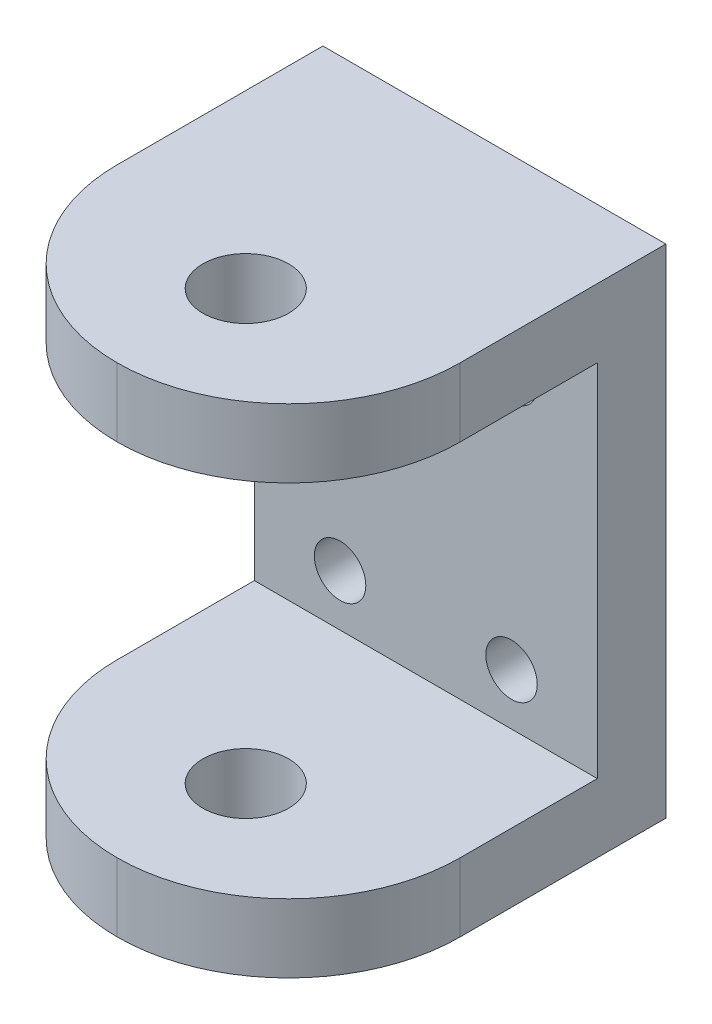
ISO-10303-21;
HEADER;
FILE_DESCRIPTION(('STEP AP214'),'2;1');
FILE_NAME('part.step','',(''),(''),'','','');
FILE_SCHEMA(('AUTOMOTIVE_DESIGN { 1 0 10303 214 1 1 1 1 }'));
ENDSEC;
DATA;
#1=APPLICATION_CONTEXT('core data for automotive mechanical design processes');
#2=APPLICATION_PROTOCOL_DEFINITION('international standard','automotive_design',2000,#1);
#3=PRODUCT_CONTEXT('',#1,'mechanical');
#4=PRODUCT('Part','Part','',(#3));
#5=PRODUCT_RELATED_PRODUCT_CATEGORY('part','',(#4));
#6=PRODUCT_DEFINITION_FORMATION('','',#4);
#7=PRODUCT_DEFINITION_CONTEXT('part definition',#1,'design');
#8=PRODUCT_DEFINITION('design','',#6,#7);
#9=PRODUCT_DEFINITION_SHAPE('','',#8);
#10=(LENGTH_UNIT() NAMED_UNIT(*) SI_UNIT(.MILLI.,.METRE.));
#11=(NAMED_UNIT(*) PLANE_ANGLE_UNIT() SI_UNIT($,.RADIAN.));
#12=(NAMED_UNIT(*) SI_UNIT($,.STERADIAN.) SOLID_ANGLE_UNIT());
#13=UNCERTAINTY_MEASURE_WITH_UNIT(LENGTH_MEASURE(1.E-05),#10,'distance_accuracy_value','');
#14=(GEOMETRIC_REPRESENTATION_CONTEXT(3) GLOBAL_UNCERTAINTY_ASSIGNED_CONTEXT((#13)) GLOBAL_UNIT_ASSIGNED_CONTEXT((#10,
#11,#12)) REPRESENTATION_CONTEXT('',''));
#15=CARTESIAN_POINT('',(0.,0.,0.));
#16=DIRECTION('',(0.,0.,1.));
#17=DIRECTION('',(1.,0.,0.));
#18=AXIS2_PLACEMENT_3D('',#15,#16,#17);
#19=CARTESIAN_POINT('',(0.,0.,4.));
#20=DIRECTION('',(0.,0.,1.));
#21=DIRECTION('',(1.,0.,0.));
#22=AXIS2_PLACEMENT_3D('',#19,#20,#21);
#23=PLANE('',#22);
#24=CARTESIAN_POINT('',(5.,-7.5,4.));
#25=DIRECTION('',(0.,0.,1.));
#26=DIRECTION('',(1.,0.,0.));
#27=AXIS2_PLACEMENT_3D('',#24,#25,#26);
#28=CIRCLE('',#27,1.5);
#29=CARTESIAN_POINT('',(6.5,-7.5,4.));
#30=VERTEX_POINT('',#29);
#31=EDGE_CURVE('E151',#30,#30,#28,.T.);
#32=ORIENTED_EDGE('',*,*,#31,.F.);
#33=EDGE_LOOP('',(#32));
#34=FACE_BOUND('',#33,.T.);
#35=CARTESIAN_POINT('',(-4.99999999999999,-7.5,4.));
#36=DIRECTION('',(0.,0.,1.));
#37=DIRECTION('',(1.,0.,0.));
#38=AXIS2_PLACEMENT_3D('',#35,#36,#37);
#39=CIRCLE('',#38,1.5);
#40=CARTESIAN_POINT('',(-3.49999999999999,-7.5,4.));
#41=VERTEX_POINT('',#40);
#42=EDGE_CURVE('E154',#41,#41,#39,.T.);
#43=ORIENTED_EDGE('',*,*,#42,.F.);
#44=EDGE_LOOP('',(#43));
#45=FACE_BOUND('',#44,.T.);
#46=CARTESIAN_POINT('',(5.,7.5,4.));
#47=DIRECTION('',(0.,0.,1.));
#48=DIRECTION('',(1.,0.,0.));
#49=AXIS2_PLACEMENT_3D('',#46,#47,#48);
#50=CIRCLE('',#49,1.5);
#51=CARTESIAN_POINT('',(6.5,7.5,4.));
#52=VERTEX_POINT('',#51);
#53=EDGE_CURVE('E158',#52,#52,#50,.T.);
#54=ORIENTED_EDGE('',*,*,#53,.F.);
#55=EDGE_LOOP('',(#54));
#56=FACE_BOUND('',#55,.T.);
#57=CARTESIAN_POINT('',(-5.,7.5,4.));
#58=DIRECTION('',(0.,0.,1.));
#59=DIRECTION('',(1.,0.,0.));
#60=AXIS2_PLACEMENT_3D('',#57,#58,#59);
#61=CIRCLE('',#60,1.5);
#62=CARTESIAN_POINT('',(-3.5,7.5,4.));
#63=VERTEX_POINT('',#62);
#64=EDGE_CURVE('E139',#63,#63,#61,.T.);
#65=ORIENTED_EDGE('',*,*,#64,.F.);
#66=EDGE_LOOP('',(#65));
#67=FACE_BOUND('',#66,.T.);
#68=DIRECTION('',(0.,-1.,0.));
#69=VECTOR('',#68,1.);
#70=CARTESIAN_POINT('',(-10.,0.,4.));
#71=LINE('',#70,#69);
#72=CARTESIAN_POINT('',(-10.,10.5,4.));
#73=VERTEX_POINT('',#72);
#74=CARTESIAN_POINT('',(-10.,-10.5,4.));
#75=VERTEX_POINT('',#74);
#76=EDGE_CURVE('E138',#73,#75,#71,.T.);
#77=ORIENTED_EDGE('',*,*,#76,.T.);
#78=DIRECTION('',(-1.,0.,0.));
#79=VECTOR('',#78,1.);
#80=CARTESIAN_POINT('',(10.,-10.5,4.));
#81=LINE('',#80,#79);
#82=CARTESIAN_POINT('',(10.,-10.5,4.));
#83=VERTEX_POINT('',#82);
#84=EDGE_CURVE('E137',#83,#75,#81,.T.);
#85=ORIENTED_EDGE('',*,*,#84,.F.);
#86=DIRECTION('',(0.,-1.,0.));
#87=VECTOR('',#86,1.);
#88=CARTESIAN_POINT('',(10.,0.,4.));
#89=LINE('',#88,#87);
#90=CARTESIAN_POINT('',(10.,10.5,4.));
#91=VERTEX_POINT('',#90);
#92=EDGE_CURVE('E123',#91,#83,#89,.T.);
#93=ORIENTED_EDGE('',*,*,#92,.F.);
#94=DIRECTION('',(1.,0.,0.));
#95=VECTOR('',#94,1.);
#96=CARTESIAN_POINT('',(-10.,10.5,4.));
#97=LINE('',#96,#95);
#98=EDGE_CURVE('E129',#73,#91,#97,.T.);
#99=ORIENTED_EDGE('',*,*,#98,.F.);
#100=EDGE_LOOP('',(#77,#85,#93,#99));
#101=FACE_BOUND('',#100,.T.);
#102=ADVANCED_FACE('F39',(#34,#45,#56,#67,#101),#23,.T.);
#103=CARTESIAN_POINT('',(10.,0.,4.));
#104=DIRECTION('',(1.,0.,0.));
#105=DIRECTION('',(0.,1.,0.));
#106=AXIS2_PLACEMENT_3D('',#103,#104,#105);
#107=PLANE('',#106);
#108=DIRECTION('',(0.,0.,-1.));
#109=VECTOR('',#108,1.);
#110=CARTESIAN_POINT('',(10.,14.5,4.));
#111=LINE('',#110,#109);
#112=CARTESIAN_POINT('',(10.,14.5,12.));
#113=VERTEX_POINT('',#112);
#114=CARTESIAN_POINT('',(10.,14.5,0.));
#115=VERTEX_POINT('',#114);
#116=EDGE_CURVE('E192',#113,#115,#111,.T.);
#117=ORIENTED_EDGE('',*,*,#116,.F.);
#118=DIRECTION('',(0.,1.,0.));
#119=VECTOR('',#118,1.);
#120=CARTESIAN_POINT('',(10.,0.,12.));
#121=LINE('',#120,#119);
#122=CARTESIAN_POINT('',(10.,10.5,12.));
#123=VERTEX_POINT('',#122);
#124=EDGE_CURVE('E125',#113,#123,#121,.F.);
#125=ORIENTED_EDGE('',*,*,#124,.T.);
#126=DIRECTION('',(0.,0.,-1.));
#127=VECTOR('',#126,1.);
#128=CARTESIAN_POINT('',(10.,10.5,22.));
#129=LINE('',#128,#127);
#130=EDGE_CURVE('E118',#123,#91,#129,.T.);
#131=ORIENTED_EDGE('',*,*,#130,.T.);
#132=ORIENTED_EDGE('',*,*,#92,.T.);
#133=DIRECTION('',(0.,0.,-1.));
#134=VECTOR('',#133,1.);
#135=CARTESIAN_POINT('',(10.,-10.5,22.));
#136=LINE('',#135,#134);
#137=CARTESIAN_POINT('',(10.,-10.5,12.));
#138=VERTEX_POINT('',#137);
#139=EDGE_CURVE('E143',#138,#83,#136,.T.);
#140=ORIENTED_EDGE('',*,*,#139,.F.);
#141=DIRECTION('',(0.,1.,0.));
#142=VECTOR('',#141,1.);
#143=CARTESIAN_POINT('',(10.,0.,12.));
#144=LINE('',#143,#142);
#145=CARTESIAN_POINT('',(10.,-14.5,12.));
#146=VERTEX_POINT('',#145);
#147=EDGE_CURVE('E203',#138,#146,#144,.F.);
#148=ORIENTED_EDGE('',*,*,#147,.T.);
#149=DIRECTION('',(0.,0.,-1.));
#150=VECTOR('',#149,1.);
#151=CARTESIAN_POINT('',(10.,-14.5,4.));
#152=LINE('',#151,#150);
#153=CARTESIAN_POINT('',(10.,-14.5,0.));
#154=VERTEX_POINT('',#153);
#155=EDGE_CURVE('E164',#146,#154,#152,.T.);
#156=ORIENTED_EDGE('',*,*,#155,.T.);
#157=DIRECTION('',(0.,-1.,0.));
#158=VECTOR('',#157,1.);
#159=CARTESIAN_POINT('',(10.,0.,0.));
#160=LINE('',#159,#158);
#161=EDGE_CURVE('E176',#115,#154,#160,.T.);
#162=ORIENTED_EDGE('',*,*,#161,.F.);
#163=EDGE_LOOP('',(#117,#125,#131,#132,#140,#148,#156,#162));
#164=FACE_BOUND('',#163,.T.);
#165=ADVANCED_FACE('F121',(#164),#107,.T.);
#166=CARTESIAN_POINT('',(0.,14.5,4.));
#167=DIRECTION('',(0.,1.,0.));
#168=DIRECTION('',(0.,0.,1.));
#169=AXIS2_PLACEMENT_3D('',#166,#167,#168);
#170=PLANE('',#169);
#171=CARTESIAN_POINT('',(0.,14.5,14.5));
#172=DIRECTION('',(0.,-1.,0.));
#173=DIRECTION('',(0.,0.,-1.));
#174=AXIS2_PLACEMENT_3D('',#171,#172,#173);
#175=CIRCLE('',#174,2.5);
#176=CARTESIAN_POINT('',(0.,14.5,12.));
#177=VERTEX_POINT('',#176);
#178=EDGE_CURVE('E199',#177,#177,#175,.T.);
#179=ORIENTED_EDGE('',*,*,#178,.T.);
#180=EDGE_LOOP('',(#179));
#181=FACE_BOUND('',#180,.T.);
#182=CARTESIAN_POINT('',(0.,14.5,12.));
#183=DIRECTION('',(0.,1.,0.));
#184=DIRECTION('',(0.,0.,1.));
#185=AXIS2_PLACEMENT_3D('',#182,#183,#184);
#186=CIRCLE('',#185,10.);
#187=CARTESIAN_POINT('',(-10.,14.5,12.));
#188=VERTEX_POINT('',#187);
#189=CARTESIAN_POINT('',(0.,14.5,22.));
#190=VERTEX_POINT('',#189);
#191=EDGE_CURVE('E194',#188,#190,#186,.T.);
#192=ORIENTED_EDGE('',*,*,#191,.T.);
#193=CARTESIAN_POINT('',(0.,14.5,12.));
#194=DIRECTION('',(0.,1.,0.));
#195=DIRECTION('',(0.,0.,1.));
#196=AXIS2_PLACEMENT_3D('',#193,#194,#195);
#197=CIRCLE('',#196,10.);
#198=EDGE_CURVE('E201',#190,#113,#197,.T.);
#199=ORIENTED_EDGE('',*,*,#198,.T.);
#200=ORIENTED_EDGE('',*,*,#116,.T.);
#201=DIRECTION('',(1.,0.,0.));
#202=VECTOR('',#201,1.);
#203=CARTESIAN_POINT('',(0.,14.5,0.));
#204=LINE('',#203,#202);
#205=CARTESIAN_POINT('',(-10.,14.5,0.));
#206=VERTEX_POINT('',#205);
#207=EDGE_CURVE('E179',#206,#115,#204,.T.);
#208=ORIENTED_EDGE('',*,*,#207,.F.);
#209=DIRECTION('',(0.,0.,-1.));
#210=VECTOR('',#209,1.);
#211=CARTESIAN_POINT('',(-10.,14.5,4.));
#212=LINE('',#211,#210);
#213=EDGE_CURVE('E190',#188,#206,#212,.T.);
#214=ORIENTED_EDGE('',*,*,#213,.F.);
#215=EDGE_LOOP('',(#192,#199,#200,#208,#214));
#216=FACE_BOUND('',#215,.T.);
#217=ADVANCED_FACE('F252',(#181,#216),#170,.T.);
#218=CARTESIAN_POINT('',(-10.,0.,4.));
#219=DIRECTION('',(1.,0.,0.));
#220=DIRECTION('',(0.,1.,0.));
#221=AXIS2_PLACEMENT_3D('',#218,#219,#220);
#222=PLANE('',#221);
#223=DIRECTION('',(0.,0.,-1.));
#224=VECTOR('',#223,1.);
#225=CARTESIAN_POINT('',(-10.,10.5,22.));
#226=LINE('',#225,#224);
#227=CARTESIAN_POINT('',(-10.,10.5,12.));
#228=VERTEX_POINT('',#227);
#229=EDGE_CURVE('E128',#228,#73,#226,.T.);
#230=ORIENTED_EDGE('',*,*,#229,.F.);
#231=DIRECTION('',(0.,-1.,0.));
#232=VECTOR('',#231,1.);
#233=CARTESIAN_POINT('',(-10.,14.5,12.));
#234=LINE('',#233,#232);
#235=EDGE_CURVE('E213',#228,#188,#234,.F.);
#236=ORIENTED_EDGE('',*,*,#235,.T.);
#237=ORIENTED_EDGE('',*,*,#213,.T.);
#238=DIRECTION('',(0.,-1.,0.));
#239=VECTOR('',#238,1.);
#240=CARTESIAN_POINT('',(-10.,0.,0.));
#241=LINE('',#240,#239);
#242=CARTESIAN_POINT('',(-10.,-14.5,0.));
#243=VERTEX_POINT('',#242);
#244=EDGE_CURVE('E182',#206,#243,#241,.T.);
#245=ORIENTED_EDGE('',*,*,#244,.T.);
#246=DIRECTION('',(0.,0.,-1.));
#247=VECTOR('',#246,1.);
#248=CARTESIAN_POINT('',(-10.,-14.5,4.));
#249=LINE('',#248,#247);
#250=CARTESIAN_POINT('',(-10.,-14.5,12.));
#251=VERTEX_POINT('',#250);
#252=EDGE_CURVE('E188',#251,#243,#249,.T.);
#253=ORIENTED_EDGE('',*,*,#252,.F.);
#254=DIRECTION('',(0.,-1.,0.));
#255=VECTOR('',#254,1.);
#256=CARTESIAN_POINT('',(-10.,-10.5,12.));
#257=LINE('',#256,#255);
#258=CARTESIAN_POINT('',(-10.,-10.5,12.));
#259=VERTEX_POINT('',#258);
#260=EDGE_CURVE('E210',#251,#259,#257,.F.);
#261=ORIENTED_EDGE('',*,*,#260,.T.);
#262=DIRECTION('',(0.,0.,-1.));
#263=VECTOR('',#262,1.);
#264=CARTESIAN_POINT('',(-10.,-10.5,22.));
#265=LINE('',#264,#263);
#266=EDGE_CURVE('E145',#259,#75,#265,.T.);
#267=ORIENTED_EDGE('',*,*,#266,.T.);
#268=ORIENTED_EDGE('',*,*,#76,.F.);
#269=EDGE_LOOP('',(#230,#236,#237,#245,#253,#261,#267,#268));
#270=FACE_BOUND('',#269,.T.);
#271=ADVANCED_FACE('F251',(#270),#222,.F.);
#272=CARTESIAN_POINT('',(-5.,7.5,4.));
#273=DIRECTION('',(0.,0.,-1.));
#274=DIRECTION('',(-1.,0.,0.));
#275=AXIS2_PLACEMENT_3D('',#272,#273,#274);
#276=CYLINDRICAL_SURFACE('',#275,1.5);
#277=ORIENTED_EDGE('',*,*,#64,.T.);
#278=EDGE_LOOP('',(#277));
#279=FACE_BOUND('',#278,.T.);
#280=CARTESIAN_POINT('',(-5.,7.5,0.));
#281=DIRECTION('',(0.,0.,1.));
#282=DIRECTION('',(1.,0.,0.));
#283=AXIS2_PLACEMENT_3D('',#280,#281,#282);
#284=CIRCLE('',#283,1.5);
#285=CARTESIAN_POINT('',(-3.5,7.5,0.));
#286=VERTEX_POINT('',#285);
#287=EDGE_CURVE('E173',#286,#286,#284,.T.);
#288=ORIENTED_EDGE('',*,*,#287,.F.);
#289=EDGE_LOOP('',(#288));
#290=FACE_BOUND('',#289,.T.);
#291=ADVANCED_FACE('F260',(#279,#290),#276,.F.);
#292=CARTESIAN_POINT('',(5.,7.5,4.));
#293=DIRECTION('',(0.,0.,-1.));
#294=DIRECTION('',(-1.,0.,0.));
#295=AXIS2_PLACEMENT_3D('',#292,#293,#294);
#296=CYLINDRICAL_SURFACE('',#295,1.5);
#297=ORIENTED_EDGE('',*,*,#53,.T.);
#298=EDGE_LOOP('',(#297));
#299=FACE_BOUND('',#298,.T.);
#300=CARTESIAN_POINT('',(5.,7.5,0.));
#301=DIRECTION('',(0.,0.,1.));
#302=DIRECTION('',(1.,0.,0.));
#303=AXIS2_PLACEMENT_3D('',#300,#301,#302);
#304=CIRCLE('',#303,1.5);
#305=CARTESIAN_POINT('',(6.5,7.5,0.));
#306=VERTEX_POINT('',#305);
#307=EDGE_CURVE('E170',#306,#306,#304,.T.);
#308=ORIENTED_EDGE('',*,*,#307,.F.);
#309=EDGE_LOOP('',(#308));
#310=FACE_BOUND('',#309,.T.);
#311=ADVANCED_FACE('F403',(#299,#310),#296,.F.);
#312=CARTESIAN_POINT('',(-4.99999999999999,-7.5,4.));
#313=DIRECTION('',(0.,0.,-1.));
#314=DIRECTION('',(-1.,0.,0.));
#315=AXIS2_PLACEMENT_3D('',#312,#313,#314);
#316=CYLINDRICAL_SURFACE('',#315,1.5);
#317=ORIENTED_EDGE('',*,*,#42,.T.);
#318=EDGE_LOOP('',(#317));
#319=FACE_BOUND('',#318,.T.);
#320=CARTESIAN_POINT('',(-4.99999999999999,-7.5,0.));
#321=DIRECTION('',(0.,0.,1.));
#322=DIRECTION('',(1.,0.,0.));
#323=AXIS2_PLACEMENT_3D('',#320,#321,#322);
#324=CIRCLE('',#323,1.5);
#325=CARTESIAN_POINT('',(-3.49999999999999,-7.5,0.));
#326=VERTEX_POINT('',#325);
#327=EDGE_CURVE('E167',#326,#326,#324,.T.);
#328=ORIENTED_EDGE('',*,*,#327,.F.);
#329=EDGE_LOOP('',(#328));
#330=FACE_BOUND('',#329,.T.);
#331=ADVANCED_FACE('F283',(#319,#330),#316,.F.);
#332=CARTESIAN_POINT('',(5.,-7.5,4.));
#333=DIRECTION('',(0.,0.,-1.));
#334=DIRECTION('',(-1.,0.,0.));
#335=AXIS2_PLACEMENT_3D('',#332,#333,#334);
#336=CYLINDRICAL_SURFACE('',#335,1.5);
#337=ORIENTED_EDGE('',*,*,#31,.T.);
#338=EDGE_LOOP('',(#337));
#339=FACE_BOUND('',#338,.T.);
#340=CARTESIAN_POINT('',(5.,-7.5,0.));
#341=DIRECTION('',(0.,0.,1.));
#342=DIRECTION('',(1.,0.,0.));
#343=AXIS2_PLACEMENT_3D('',#340,#341,#342);
#344=CIRCLE('',#343,1.5);
#345=CARTESIAN_POINT('',(6.5,-7.5,0.));
#346=VERTEX_POINT('',#345);
#347=EDGE_CURVE('E150',#346,#346,#344,.T.);
#348=ORIENTED_EDGE('',*,*,#347,.F.);
#349=EDGE_LOOP('',(#348));
#350=FACE_BOUND('',#349,.T.);
#351=ADVANCED_FACE('F278',(#339,#350),#336,.F.);
#352=CARTESIAN_POINT('',(0.,-14.5,4.));
#353=DIRECTION('',(0.,1.,0.));
#354=DIRECTION('',(0.,0.,1.));
#355=AXIS2_PLACEMENT_3D('',#352,#353,#354);
#356=PLANE('',#355);
#357=CARTESIAN_POINT('',(0.,-14.5,14.5));
#358=DIRECTION('',(0.,-1.,0.));
#359=DIRECTION('',(0.,0.,-1.));
#360=AXIS2_PLACEMENT_3D('',#357,#358,#359);
#361=CIRCLE('',#360,2.5);
#362=CARTESIAN_POINT('',(0.,-14.5,12.));
#363=VERTEX_POINT('',#362);
#364=EDGE_CURVE('E220',#363,#363,#361,.T.);
#365=ORIENTED_EDGE('',*,*,#364,.F.);
#366=EDGE_LOOP('',(#365));
#367=FACE_BOUND('',#366,.T.);
#368=CARTESIAN_POINT('',(0.,-14.5,12.));
#369=DIRECTION('',(0.,1.,0.));
#370=DIRECTION('',(0.,0.,1.));
#371=AXIS2_PLACEMENT_3D('',#368,#369,#370);
#372=CIRCLE('',#371,10.);
#373=CARTESIAN_POINT('',(0.,-14.5,22.));
#374=VERTEX_POINT('',#373);
#375=EDGE_CURVE('E62',#146,#374,#372,.F.);
#376=ORIENTED_EDGE('',*,*,#375,.T.);
#377=CARTESIAN_POINT('',(0.,-14.5,12.));
#378=DIRECTION('',(0.,1.,0.));
#379=DIRECTION('',(0.,0.,1.));
#380=AXIS2_PLACEMENT_3D('',#377,#378,#379);
#381=CIRCLE('',#380,10.);
#382=EDGE_CURVE('E216',#374,#251,#381,.F.);
#383=ORIENTED_EDGE('',*,*,#382,.T.);
#384=ORIENTED_EDGE('',*,*,#252,.T.);
#385=DIRECTION('',(1.,0.,0.));
#386=VECTOR('',#385,1.);
#387=CARTESIAN_POINT('',(0.,-14.5,0.));
#388=LINE('',#387,#386);
#389=EDGE_CURVE('E155',#243,#154,#388,.T.);
#390=ORIENTED_EDGE('',*,*,#389,.T.);
#391=ORIENTED_EDGE('',*,*,#155,.F.);
#392=EDGE_LOOP('',(#376,#383,#384,#390,#391));
#393=FACE_BOUND('',#392,.T.);
#394=ADVANCED_FACE('F235',(#367,#393),#356,.F.);
#395=CARTESIAN_POINT('',(0.,0.,0.));
#396=DIRECTION('',(0.,0.,1.));
#397=DIRECTION('',(1.,0.,0.));
#398=AXIS2_PLACEMENT_3D('',#395,#396,#397);
#399=PLANE('',#398);
#400=ORIENTED_EDGE('',*,*,#347,.T.);
#401=EDGE_LOOP('',(#400));
#402=FACE_BOUND('',#401,.T.);
#403=ORIENTED_EDGE('',*,*,#327,.T.);
#404=EDGE_LOOP('',(#403));
#405=FACE_BOUND('',#404,.T.);
#406=ORIENTED_EDGE('',*,*,#307,.T.);
#407=EDGE_LOOP('',(#406));
#408=FACE_BOUND('',#407,.T.);
#409=ORIENTED_EDGE('',*,*,#287,.T.);
#410=EDGE_LOOP('',(#409));
#411=FACE_BOUND('',#410,.T.);
#412=ORIENTED_EDGE('',*,*,#161,.T.);
#413=ORIENTED_EDGE('',*,*,#389,.F.);
#414=ORIENTED_EDGE('',*,*,#244,.F.);
#415=ORIENTED_EDGE('',*,*,#207,.T.);
#416=EDGE_LOOP('',(#412,#413,#414,#415));
#417=FACE_BOUND('',#416,.T.);
#418=ADVANCED_FACE('F240',(#402,#405,#408,#411,#417),#399,.F.);
#419=CARTESIAN_POINT('',(-10.,10.5,22.));
#420=DIRECTION('',(0.,1.,0.));
#421=DIRECTION('',(-1.,0.,0.));
#422=AXIS2_PLACEMENT_3D('',#419,#420,#421);
#423=PLANE('',#422);
#424=CARTESIAN_POINT('',(0.,10.5,14.5));
#425=DIRECTION('',(0.,1.,0.));
#426=DIRECTION('',(-1.,0.,0.));
#427=AXIS2_PLACEMENT_3D('',#424,#425,#426);
#428=CIRCLE('',#427,2.5);
#429=CARTESIAN_POINT('',(0.,10.5,12.));
#430=VERTEX_POINT('',#429);
#431=EDGE_CURVE('E198',#430,#430,#428,.T.);
#432=ORIENTED_EDGE('',*,*,#431,.T.);
#433=EDGE_LOOP('',(#432));
#434=FACE_BOUND('',#433,.T.);
#435=ORIENTED_EDGE('',*,*,#130,.F.);
#436=CARTESIAN_POINT('',(0.,10.5,12.));
#437=DIRECTION('',(0.,1.,0.));
#438=DIRECTION('',(-1.,0.,0.));
#439=AXIS2_PLACEMENT_3D('',#436,#437,#438);
#440=CIRCLE('',#439,10.);
#441=CARTESIAN_POINT('',(0.,10.5,22.));
#442=VERTEX_POINT('',#441);
#443=EDGE_CURVE('E208',#123,#442,#440,.F.);
#444=ORIENTED_EDGE('',*,*,#443,.T.);
#445=CARTESIAN_POINT('',(0.,10.5,12.));
#446=DIRECTION('',(0.,1.,0.));
#447=DIRECTION('',(-1.,0.,0.));
#448=AXIS2_PLACEMENT_3D('',#445,#446,#447);
#449=CIRCLE('',#448,10.);
#450=EDGE_CURVE('E206',#442,#228,#449,.F.);
#451=ORIENTED_EDGE('',*,*,#450,.T.);
#452=ORIENTED_EDGE('',*,*,#229,.T.);
#453=ORIENTED_EDGE('',*,*,#98,.T.);
#454=EDGE_LOOP('',(#435,#444,#451,#452,#453));
#455=FACE_BOUND('',#454,.T.);
#456=ADVANCED_FACE('F141',(#434,#455),#423,.F.);
#457=CARTESIAN_POINT('',(10.,-10.5,22.));
#458=DIRECTION('',(0.,-1.,0.));
#459=DIRECTION('',(1.,0.,0.));
#460=AXIS2_PLACEMENT_3D('',#457,#458,#459);
#461=PLANE('',#460);
#462=CARTESIAN_POINT('',(0.,-10.5,14.5));
#463=DIRECTION('',(0.,-1.,0.));
#464=DIRECTION('',(1.,0.,0.));
#465=AXIS2_PLACEMENT_3D('',#462,#463,#464);
#466=CIRCLE('',#465,2.5);
#467=CARTESIAN_POINT('',(0.,-10.5,12.));
#468=VERTEX_POINT('',#467);
#469=EDGE_CURVE('E195',#468,#468,#466,.T.);
#470=ORIENTED_EDGE('',*,*,#469,.T.);
#471=EDGE_LOOP('',(#470));
#472=FACE_BOUND('',#471,.T.);
#473=ORIENTED_EDGE('',*,*,#266,.F.);
#474=CARTESIAN_POINT('',(0.,-10.5,12.));
#475=DIRECTION('',(0.,-1.,0.));
#476=DIRECTION('',(1.,0.,0.));
#477=AXIS2_PLACEMENT_3D('',#474,#475,#476);
#478=CIRCLE('',#477,10.);
#479=CARTESIAN_POINT('',(0.,-10.5,22.));
#480=VERTEX_POINT('',#479);
#481=EDGE_CURVE('E11',#259,#480,#478,.F.);
#482=ORIENTED_EDGE('',*,*,#481,.T.);
#483=CARTESIAN_POINT('',(0.,-10.5,12.));
#484=DIRECTION('',(0.,-1.,0.));
#485=DIRECTION('',(1.,0.,0.));
#486=AXIS2_PLACEMENT_3D('',#483,#484,#485);
#487=CIRCLE('',#486,10.);
#488=EDGE_CURVE('E48',#480,#138,#487,.F.);
#489=ORIENTED_EDGE('',*,*,#488,.T.);
#490=ORIENTED_EDGE('',*,*,#139,.T.);
#491=ORIENTED_EDGE('',*,*,#84,.T.);
#492=EDGE_LOOP('',(#473,#482,#489,#490,#491));
#493=FACE_BOUND('',#492,.T.);
#494=ADVANCED_FACE('F233',(#472,#493),#461,.F.);
#495=CARTESIAN_POINT('',(0.,14.5,14.5));
#496=DIRECTION('',(0.,-1.,0.));
#497=DIRECTION('',(0.,0.,-1.));
#498=AXIS2_PLACEMENT_3D('',#495,#496,#497);
#499=CYLINDRICAL_SURFACE('',#498,2.5);
#500=CARTESIAN_POINT('',(0.,-14.5,12.));
#501=CARTESIAN_POINT('',(0.,-14.4583333333333,12.));
#502=CARTESIAN_POINT('',(0.,-14.4166666666667,12.));
#503=CARTESIAN_POINT('',(0.,-14.3333333333333,12.));
#504=CARTESIAN_POINT('',(0.,-14.2916666666667,12.));
#505=CARTESIAN_POINT('',(0.,-14.2083333333333,12.));
#506=CARTESIAN_POINT('',(0.,-14.1666666666667,12.));
#507=CARTESIAN_POINT('',(0.,-14.0833333333333,12.));
#508=CARTESIAN_POINT('',(0.,-14.0416666666667,12.));
#509=CARTESIAN_POINT('',(0.,-13.9583333333333,12.));
#510=CARTESIAN_POINT('',(0.,-13.9166666666667,12.));
#511=CARTESIAN_POINT('',(0.,-13.8333333333333,12.));
#512=CARTESIAN_POINT('',(0.,-13.7916666666667,12.));
#513=CARTESIAN_POINT('',(0.,-13.7083333333333,12.));
#514=CARTESIAN_POINT('',(0.,-13.6666666666667,12.));
#515=CARTESIAN_POINT('',(0.,-13.5833333333333,12.));
#516=CARTESIAN_POINT('',(0.,-13.5416666666667,12.));
#517=CARTESIAN_POINT('',(0.,-13.4583333333333,12.));
#518=CARTESIAN_POINT('',(0.,-13.4166666666667,12.));
#519=CARTESIAN_POINT('',(0.,-13.3333333333333,12.));
#520=CARTESIAN_POINT('',(0.,-13.2916666666667,12.));
#521=CARTESIAN_POINT('',(0.,-13.2083333333333,12.));
#522=CARTESIAN_POINT('',(0.,-13.1666666666667,12.));
#523=CARTESIAN_POINT('',(0.,-13.0833333333333,12.));
#524=CARTESIAN_POINT('',(0.,-13.0416666666667,12.));
#525=CARTESIAN_POINT('',(0.,-12.9583333333333,12.));
#526=CARTESIAN_POINT('',(0.,-12.9166666666667,12.));
#527=CARTESIAN_POINT('',(0.,-12.8333333333333,12.));
#528=CARTESIAN_POINT('',(0.,-12.7916666666667,12.));
#529=CARTESIAN_POINT('',(0.,-12.7083333333333,12.));
#530=CARTESIAN_POINT('',(0.,-12.6666666666667,12.));
#531=CARTESIAN_POINT('',(0.,-12.5833333333333,12.));
#532=CARTESIAN_POINT('',(0.,-12.5416666666667,12.));
#533=CARTESIAN_POINT('',(0.,-12.4583333333333,12.));
#534=CARTESIAN_POINT('',(0.,-12.4166666666667,12.));
#535=CARTESIAN_POINT('',(0.,-12.3333333333333,12.));
#536=CARTESIAN_POINT('',(0.,-12.2916666666667,12.));
#537=CARTESIAN_POINT('',(0.,-12.2083333333333,12.));
#538=CARTESIAN_POINT('',(0.,-12.1666666666667,12.));
#539=CARTESIAN_POINT('',(0.,-12.0833333333333,12.));
#540=CARTESIAN_POINT('',(0.,-12.0416666666667,12.));
#541=CARTESIAN_POINT('',(0.,-11.9583333333333,12.));
#542=CARTESIAN_POINT('',(0.,-11.9166666666667,12.));
#543=CARTESIAN_POINT('',(0.,-11.8333333333333,12.));
#544=CARTESIAN_POINT('',(0.,-11.7916666666667,12.));
#545=CARTESIAN_POINT('',(0.,-11.7083333333333,12.));
#546=CARTESIAN_POINT('',(0.,-11.6666666666667,12.));
#547=CARTESIAN_POINT('',(0.,-11.5833333333333,12.));
#548=CARTESIAN_POINT('',(0.,-11.5416666666667,12.));
#549=CARTESIAN_POINT('',(0.,-11.4583333333333,12.));
#550=CARTESIAN_POINT('',(0.,-11.4166666666667,12.));
#551=CARTESIAN_POINT('',(0.,-11.3333333333333,12.));
#552=CARTESIAN_POINT('',(0.,-11.2916666666667,12.));
#553=CARTESIAN_POINT('',(0.,-11.2083333333333,12.));
#554=CARTESIAN_POINT('',(0.,-11.1666666666667,12.));
#555=CARTESIAN_POINT('',(0.,-11.0833333333333,12.));
#556=CARTESIAN_POINT('',(0.,-11.0416666666667,12.));
#557=CARTESIAN_POINT('',(0.,-10.9583333333333,12.));
#558=CARTESIAN_POINT('',(0.,-10.9166666666667,12.));
#559=CARTESIAN_POINT('',(0.,-10.8333333333333,12.));
#560=CARTESIAN_POINT('',(0.,-10.7916666666667,12.));
#561=CARTESIAN_POINT('',(0.,-10.7083333333333,12.));
#562=CARTESIAN_POINT('',(0.,-10.6666666666667,12.));
#563=CARTESIAN_POINT('',(0.,-10.5833333333333,12.));
#564=CARTESIAN_POINT('',(0.,-10.5416666666667,12.));
#565=CARTESIAN_POINT('',(0.,-10.5,12.));
#566=B_SPLINE_CURVE_WITH_KNOTS('',3,(#500,#501,#502,#503,#504,#505,#506,#507,#508,#509,#510,
#511,#512,#513,#514,#515,#516,#517,#518,#519,#520,#521,#522,#523,#524,#525,#526,#527,#528,#529,
#530,#531,#532,#533,#534,#535,#536,#537,#538,#539,#540,#541,#542,#543,#544,#545,#546,#547,#548,
#549,#550,#551,#552,#553,#554,#555,#556,#557,#558,#559,#560,#561,#562,#563,#564,#565),
.UNSPECIFIED.,.F.,.F.,(4,2,2,2,2,2,2,2,2,2,2,2,2,2,2,2,2,2,2,2,2,2,2,2,2,2,2,2,2,2,2,2,4),(0.,
0.125,0.25,0.375,0.5,0.625000000000001,0.750000000000001,0.875000000000001,1.,1.125,1.25,1.375,
1.5,1.625,1.75,1.875,2.,2.125,2.25,2.375,2.5,2.625,2.75,2.875,3.,3.125,3.25,3.375,3.5,3.625,
3.75,3.875,4.),.UNSPECIFIED.);
#567=EDGE_CURVE('BSEAM288',#363,#468,#566,.T.);
#568=ORIENTED_EDGE('',*,*,#364,.T.);
#569=ORIENTED_EDGE('',*,*,#469,.F.);
#570=ORIENTED_EDGE('',*,*,#567,.T.);
#571=ORIENTED_EDGE('',*,*,#567,.F.);
#572=EDGE_LOOP('',(#568,#570,#569,#571));
#573=FACE_BOUND('',#572,.T.);
#574=ADVANCED_FACE('F288',(#573),#499,.F.);
#575=CARTESIAN_POINT('',(0.,14.5,12.));
#576=CARTESIAN_POINT('',(0.,14.4583333333333,12.));
#577=CARTESIAN_POINT('',(0.,14.4166666666667,12.));
#578=CARTESIAN_POINT('',(0.,14.3333333333333,12.));
#579=CARTESIAN_POINT('',(0.,14.2916666666667,12.));
#580=CARTESIAN_POINT('',(0.,14.2083333333333,12.));
#581=CARTESIAN_POINT('',(0.,14.1666666666667,12.));
#582=CARTESIAN_POINT('',(0.,14.0833333333333,12.));
#583=CARTESIAN_POINT('',(0.,14.0416666666667,12.));
#584=CARTESIAN_POINT('',(0.,13.9583333333333,12.));
#585=CARTESIAN_POINT('',(0.,13.9166666666667,12.));
#586=CARTESIAN_POINT('',(0.,13.8333333333333,12.));
#587=CARTESIAN_POINT('',(0.,13.7916666666667,12.));
#588=CARTESIAN_POINT('',(0.,13.7083333333333,12.));
#589=CARTESIAN_POINT('',(0.,13.6666666666667,12.));
#590=CARTESIAN_POINT('',(0.,13.5833333333333,12.));
#591=CARTESIAN_POINT('',(0.,13.5416666666667,12.));
#592=CARTESIAN_POINT('',(0.,13.4583333333333,12.));
#593=CARTESIAN_POINT('',(0.,13.4166666666667,12.));
#594=CARTESIAN_POINT('',(0.,13.3333333333333,12.));
#595=CARTESIAN_POINT('',(0.,13.2916666666667,12.));
#596=CARTESIAN_POINT('',(0.,13.2083333333333,12.));
#597=CARTESIAN_POINT('',(0.,13.1666666666667,12.));
#598=CARTESIAN_POINT('',(0.,13.0833333333333,12.));
#599=CARTESIAN_POINT('',(0.,13.0416666666667,12.));
#600=CARTESIAN_POINT('',(0.,12.9583333333333,12.));
#601=CARTESIAN_POINT('',(0.,12.9166666666667,12.));
#602=CARTESIAN_POINT('',(0.,12.8333333333333,12.));
#603=CARTESIAN_POINT('',(0.,12.7916666666667,12.));
#604=CARTESIAN_POINT('',(0.,12.7083333333333,12.));
#605=CARTESIAN_POINT('',(0.,12.6666666666667,12.));
#606=CARTESIAN_POINT('',(0.,12.5833333333333,12.));
#607=CARTESIAN_POINT('',(0.,12.5416666666667,12.));
#608=CARTESIAN_POINT('',(0.,12.4583333333333,12.));
#609=CARTESIAN_POINT('',(0.,12.4166666666667,12.));
#610=CARTESIAN_POINT('',(0.,12.3333333333333,12.));
#611=CARTESIAN_POINT('',(0.,12.2916666666667,12.));
#612=CARTESIAN_POINT('',(0.,12.2083333333333,12.));
#613=CARTESIAN_POINT('',(0.,12.1666666666667,12.));
#614=CARTESIAN_POINT('',(0.,12.0833333333333,12.));
#615=CARTESIAN_POINT('',(0.,12.0416666666667,12.));
#616=CARTESIAN_POINT('',(0.,11.9583333333333,12.));
#617=CARTESIAN_POINT('',(0.,11.9166666666667,12.));
#618=CARTESIAN_POINT('',(0.,11.8333333333333,12.));
#619=CARTESIAN_POINT('',(0.,11.7916666666667,12.));
#620=CARTESIAN_POINT('',(0.,11.7083333333333,12.));
#621=CARTESIAN_POINT('',(0.,11.6666666666667,12.));
#622=CARTESIAN_POINT('',(0.,11.5833333333333,12.));
#623=CARTESIAN_POINT('',(0.,11.5416666666667,12.));
#624=CARTESIAN_POINT('',(0.,11.4583333333333,12.));
#625=CARTESIAN_POINT('',(0.,11.4166666666667,12.));
#626=CARTESIAN_POINT('',(0.,11.3333333333333,12.));
#627=CARTESIAN_POINT('',(0.,11.2916666666667,12.));
#628=CARTESIAN_POINT('',(0.,11.2083333333333,12.));
#629=CARTESIAN_POINT('',(0.,11.1666666666667,12.));
#630=CARTESIAN_POINT('',(0.,11.0833333333333,12.));
#631=CARTESIAN_POINT('',(0.,11.0416666666667,12.));
#632=CARTESIAN_POINT('',(0.,10.9583333333333,12.));
#633=CARTESIAN_POINT('',(0.,10.9166666666667,12.));
#634=CARTESIAN_POINT('',(0.,10.8333333333333,12.));
#635=CARTESIAN_POINT('',(0.,10.7916666666667,12.));
#636=CARTESIAN_POINT('',(0.,10.7083333333333,12.));
#637=CARTESIAN_POINT('',(0.,10.6666666666667,12.));
#638=CARTESIAN_POINT('',(0.,10.5833333333333,12.));
#639=CARTESIAN_POINT('',(0.,10.5416666666667,12.));
#640=CARTESIAN_POINT('',(0.,10.5,12.));
#641=B_SPLINE_CURVE_WITH_KNOTS('',3,(#575,#576,#577,#578,#579,#580,#581,#582,#583,#584,#585,
#586,#587,#588,#589,#590,#591,#592,#593,#594,#595,#596,#597,#598,#599,#600,#601,#602,#603,#604,
#605,#606,#607,#608,#609,#610,#611,#612,#613,#614,#615,#616,#617,#618,#619,#620,#621,#622,#623,
#624,#625,#626,#627,#628,#629,#630,#631,#632,#633,#634,#635,#636,#637,#638,#639,#640),
.UNSPECIFIED.,.F.,.F.,(4,2,2,2,2,2,2,2,2,2,2,2,2,2,2,2,2,2,2,2,2,2,2,2,2,2,2,2,2,2,2,2,4),(0.,
0.124999999999998,0.249999999999999,0.375,0.499999999999999,0.624999999999999,0.750000000000001,
0.875000000000001,0.999999999999999,1.125,1.25,1.375,1.5,1.625,1.75,1.875,2.,2.125,2.25,2.375,
2.5,2.625,2.75,2.875,3.,3.125,3.25,3.375,3.5,3.625,3.75,3.875,4.),.UNSPECIFIED.);
#642=EDGE_CURVE('BSEAM291',#177,#430,#641,.T.);
#643=ORIENTED_EDGE('',*,*,#178,.F.);
#644=ORIENTED_EDGE('',*,*,#431,.F.);
#645=ORIENTED_EDGE('',*,*,#642,.T.);
#646=ORIENTED_EDGE('',*,*,#642,.F.);
#647=EDGE_LOOP('',(#643,#645,#644,#646));
#648=FACE_BOUND('',#647,.T.);
#649=ADVANCED_FACE('F291',(#648),#499,.F.);
#650=CARTESIAN_POINT('',(0.,0.,12.));
#651=DIRECTION('',(0.,1.,0.));
#652=DIRECTION('',(-1.,0.,0.));
#653=AXIS2_PLACEMENT_3D('',#650,#651,#652);
#654=CYLINDRICAL_SURFACE('',#653,10.);
#655=ORIENTED_EDGE('',*,*,#235,.F.);
#656=ORIENTED_EDGE('',*,*,#450,.F.);
#657=DIRECTION('',(0.,-1.,0.));
#658=VECTOR('',#657,1.);
#659=CARTESIAN_POINT('',(0.,10.5,22.));
#660=LINE('',#659,#658);
#661=EDGE_CURVE('E218',#190,#442,#660,.T.);
#662=ORIENTED_EDGE('',*,*,#661,.F.);
#663=ORIENTED_EDGE('',*,*,#191,.F.);
#664=EDGE_LOOP('',(#655,#656,#662,#663));
#665=FACE_BOUND('',#664,.T.);
#666=ADVANCED_FACE('F247',(#665),#654,.T.);
#667=CARTESIAN_POINT('',(0.,0.,12.));
#668=DIRECTION('',(0.,1.,0.));
#669=DIRECTION('',(-1.,0.,0.));
#670=AXIS2_PLACEMENT_3D('',#667,#668,#669);
#671=CYLINDRICAL_SURFACE('',#670,10.);
#672=ORIENTED_EDGE('',*,*,#443,.F.);
#673=ORIENTED_EDGE('',*,*,#124,.F.);
#674=ORIENTED_EDGE('',*,*,#198,.F.);
#675=ORIENTED_EDGE('',*,*,#661,.T.);
#676=EDGE_LOOP('',(#672,#673,#674,#675));
#677=FACE_BOUND('',#676,.T.);
#678=ADVANCED_FACE('F243',(#677),#671,.T.);
#679=CARTESIAN_POINT('',(0.,0.,12.));
#680=DIRECTION('',(0.,1.,0.));
#681=DIRECTION('',(-1.,0.,0.));
#682=AXIS2_PLACEMENT_3D('',#679,#680,#681);
#683=CYLINDRICAL_SURFACE('',#682,10.);
#684=ORIENTED_EDGE('',*,*,#147,.F.);
#685=ORIENTED_EDGE('',*,*,#488,.F.);
#686=DIRECTION('',(0.,1.,0.));
#687=VECTOR('',#686,1.);
#688=CARTESIAN_POINT('',(0.,0.,22.));
#689=LINE('',#688,#687);
#690=EDGE_CURVE('E43',#374,#480,#689,.T.);
#691=ORIENTED_EDGE('',*,*,#690,.F.);
#692=ORIENTED_EDGE('',*,*,#375,.F.);
#693=EDGE_LOOP('',(#684,#685,#691,#692));
#694=FACE_BOUND('',#693,.T.);
#695=ADVANCED_FACE('F41',(#694),#683,.T.);
#696=CARTESIAN_POINT('',(0.,0.,12.));
#697=DIRECTION('',(0.,1.,0.));
#698=DIRECTION('',(-1.,0.,0.));
#699=AXIS2_PLACEMENT_3D('',#696,#697,#698);
#700=CYLINDRICAL_SURFACE('',#699,10.);
#701=ORIENTED_EDGE('',*,*,#481,.F.);
#702=ORIENTED_EDGE('',*,*,#260,.F.);
#703=ORIENTED_EDGE('',*,*,#382,.F.);
#704=ORIENTED_EDGE('',*,*,#690,.T.);
#705=EDGE_LOOP('',(#701,#702,#703,#704));
#706=FACE_BOUND('',#705,.T.);
#707=ADVANCED_FACE('F229',(#706),#700,.T.);
#708=CLOSED_SHELL('',(#102,#165,#217,#271,#291,#311,#331,#351,#394,#418,#456,#494,#574,#649,
#666,#678,#695,#707));
#709=MANIFOLD_SOLID_BREP('B2',#708);
#710=ADVANCED_BREP_SHAPE_REPRESENTATION('',(#18,#709),#14);
#711=SHAPE_DEFINITION_REPRESENTATION(#9,#710);
ENDSEC;
END-ISO-10303-21;
